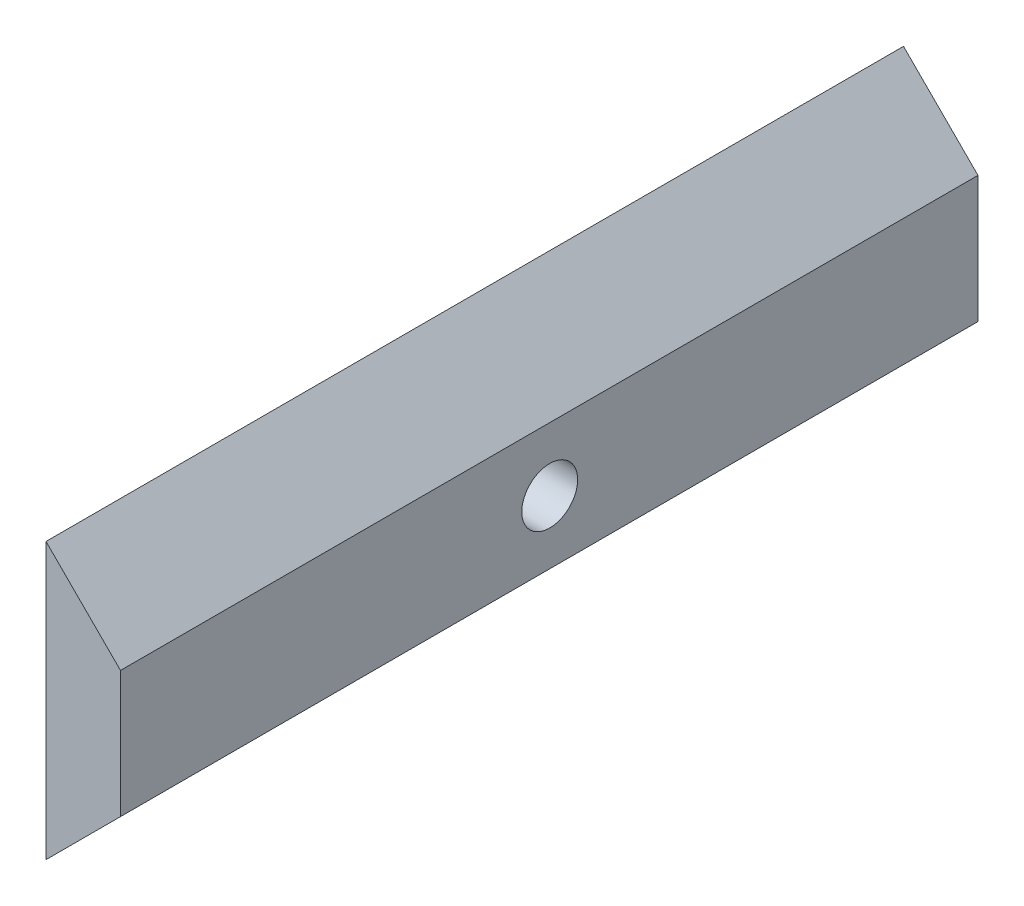
ISO-10303-21;
HEADER;
FILE_DESCRIPTION(('STEP AP214'),'2;1');
FILE_NAME('part.step','',(''),(''),'','','');
FILE_SCHEMA(('AUTOMOTIVE_DESIGN { 1 0 10303 214 1 1 1 1 }'));
ENDSEC;
DATA;
#1=APPLICATION_CONTEXT('core data for automotive mechanical design processes');
#2=APPLICATION_PROTOCOL_DEFINITION('international standard','automotive_design',2000,#1);
#3=PRODUCT_CONTEXT('',#1,'mechanical');
#4=PRODUCT('Part','Part','',(#3));
#5=PRODUCT_RELATED_PRODUCT_CATEGORY('part','',(#4));
#6=PRODUCT_DEFINITION_FORMATION('','',#4);
#7=PRODUCT_DEFINITION_CONTEXT('part definition',#1,'design');
#8=PRODUCT_DEFINITION('design','',#6,#7);
#9=PRODUCT_DEFINITION_SHAPE('','',#8);
#10=(LENGTH_UNIT() NAMED_UNIT(*) SI_UNIT(.MILLI.,.METRE.));
#11=(NAMED_UNIT(*) PLANE_ANGLE_UNIT() SI_UNIT($,.RADIAN.));
#12=(NAMED_UNIT(*) SI_UNIT($,.STERADIAN.) SOLID_ANGLE_UNIT());
#13=UNCERTAINTY_MEASURE_WITH_UNIT(LENGTH_MEASURE(1.E-05),#10,'distance_accuracy_value','');
#14=(GEOMETRIC_REPRESENTATION_CONTEXT(3) GLOBAL_UNCERTAINTY_ASSIGNED_CONTEXT((#13)) GLOBAL_UNIT_ASSIGNED_CONTEXT((#10,
#11,#12)) REPRESENTATION_CONTEXT('',''));
#15=CARTESIAN_POINT('',(0.,0.,0.));
#16=DIRECTION('',(0.,0.,1.));
#17=DIRECTION('',(1.,0.,0.));
#18=AXIS2_PLACEMENT_3D('',#15,#16,#17);
#19=CARTESIAN_POINT('',(9.02192778995276,9.02192778995276,30.6905071586947));
#20=DIRECTION('',(0.707106781186547,0.707106781186548,0.));
#21=DIRECTION('',(-0.707106781186548,0.707106781186547,0.));
#22=AXIS2_PLACEMENT_3D('',#19,#20,#21);
#23=PLANE('',#22);
#24=DIRECTION('',(-0.707106781186548,0.707106781186547,0.));
#25=VECTOR('',#24,1.);
#26=CARTESIAN_POINT('',(9.02192778995276,9.02192778995277,23.025));
#27=LINE('',#26,#25);
#28=CARTESIAN_POINT('',(12.7465605973244,5.29729498258108,23.025));
#29=VERTEX_POINT('',#28);
#30=CARTESIAN_POINT('',(10.7465605973244,7.29729498258108,23.025));
#31=VERTEX_POINT('',#30);
#32=EDGE_CURVE('E43',#29,#31,#27,.T.);
#33=ORIENTED_EDGE('',*,*,#32,.F.);
#34=DIRECTION('',(0.,0.,-1.));
#35=VECTOR('',#34,1.);
#36=CARTESIAN_POINT('',(12.7465605973244,5.29729498258108,30.6905071586947));
#37=LINE('',#36,#35);
#38=CARTESIAN_POINT('',(12.7465605973244,5.29729498258108,0.));
#39=VERTEX_POINT('',#38);
#40=EDGE_CURVE('E93',#29,#39,#37,.T.);
#41=ORIENTED_EDGE('',*,*,#40,.T.);
#42=DIRECTION('',(0.707106781186548,-0.707106781186547,0.));
#43=VECTOR('',#42,1.);
#44=CARTESIAN_POINT('',(9.02192778995276,9.02192778995276,0.));
#45=LINE('',#44,#43);
#46=CARTESIAN_POINT('',(10.7465605973244,7.29729498258108,0.));
#47=VERTEX_POINT('',#46);
#48=EDGE_CURVE('E87',#47,#39,#45,.T.);
#49=ORIENTED_EDGE('',*,*,#48,.F.);
#50=DIRECTION('',(0.,0.,-1.));
#51=VECTOR('',#50,1.);
#52=CARTESIAN_POINT('',(10.7465605973244,7.29729498258108,30.6905071586947));
#53=LINE('',#52,#51);
#54=EDGE_CURVE('E72',#31,#47,#53,.T.);
#55=ORIENTED_EDGE('',*,*,#54,.F.);
#56=EDGE_LOOP('',(#33,#41,#49,#55));
#57=FACE_BOUND('',#56,.T.);
#58=ADVANCED_FACE('F35',(#57),#23,.T.);
#59=CARTESIAN_POINT('',(10.7465605973244,0.,30.6905071586947));
#60=DIRECTION('',(1.,0.,0.));
#61=DIRECTION('',(0.,0.,-1.));
#62=AXIS2_PLACEMENT_3D('',#59,#60,#61);
#63=PLANE('',#62);
#64=CARTESIAN_POINT('',(10.7465605973244,3.59729498258107,11.5));
#65=DIRECTION('',(1.,0.,0.));
#66=DIRECTION('',(0.,0.,-1.));
#67=AXIS2_PLACEMENT_3D('',#64,#65,#66);
#68=CIRCLE('',#67,0.749999999999999);
#69=CARTESIAN_POINT('',(10.7465605973244,3.59729498258107,10.75));
#70=VERTEX_POINT('',#69);
#71=EDGE_CURVE('E96',#70,#70,#68,.F.);
#72=ORIENTED_EDGE('',*,*,#71,.F.);
#73=EDGE_LOOP('',(#72));
#74=FACE_BOUND('',#73,.T.);
#75=DIRECTION('',(0.,0.,-1.));
#76=VECTOR('',#75,1.);
#77=CARTESIAN_POINT('',(10.7465605973244,-0.102705017418907,30.6905071586947));
#78=LINE('',#77,#76);
#79=CARTESIAN_POINT('',(10.7465605973244,-0.102705017418907,23.025));
#80=VERTEX_POINT('',#79);
#81=CARTESIAN_POINT('',(10.7465605973244,-0.102705017418907,0.));
#82=VERTEX_POINT('',#81);
#83=EDGE_CURVE('E81',#80,#82,#78,.T.);
#84=ORIENTED_EDGE('',*,*,#83,.F.);
#85=DIRECTION('',(0.,1.,0.));
#86=VECTOR('',#85,1.);
#87=CARTESIAN_POINT('',(10.7465605973244,0.,23.025));
#88=LINE('',#87,#86);
#89=EDGE_CURVE('E50',#80,#31,#88,.T.);
#90=ORIENTED_EDGE('',*,*,#89,.T.);
#91=ORIENTED_EDGE('',*,*,#54,.T.);
#92=DIRECTION('',(0.,-1.,0.));
#93=VECTOR('',#92,1.);
#94=CARTESIAN_POINT('',(10.7465605973244,0.,0.));
#95=LINE('',#94,#93);
#96=EDGE_CURVE('E76',#47,#82,#95,.T.);
#97=ORIENTED_EDGE('',*,*,#96,.T.);
#98=EDGE_LOOP('',(#84,#90,#91,#97));
#99=FACE_BOUND('',#98,.T.);
#100=ADVANCED_FACE('F75',(#74,#99),#63,.F.);
#101=CARTESIAN_POINT('',(5.42463280737169,-5.42463280737168,30.6905071586947));
#102=DIRECTION('',(-0.707106781186549,0.707106781186546,0.));
#103=DIRECTION('',(-0.707106781186546,-0.707106781186549,0.));
#104=AXIS2_PLACEMENT_3D('',#101,#102,#103);
#105=PLANE('',#104);
#106=DIRECTION('',(0.,0.,-1.));
#107=VECTOR('',#106,1.);
#108=CARTESIAN_POINT('',(12.7465605973244,1.8972949825811,30.6905071586947));
#109=LINE('',#108,#107);
#110=CARTESIAN_POINT('',(12.7465605973244,1.8972949825811,23.025));
#111=VERTEX_POINT('',#110);
#112=CARTESIAN_POINT('',(12.7465605973244,1.8972949825811,0.));
#113=VERTEX_POINT('',#112);
#114=EDGE_CURVE('E104',#111,#113,#109,.T.);
#115=ORIENTED_EDGE('',*,*,#114,.F.);
#116=DIRECTION('',(-0.707106781186546,-0.707106781186549,0.));
#117=VECTOR('',#116,1.);
#118=CARTESIAN_POINT('',(5.4246328073717,-5.42463280737167,23.025));
#119=LINE('',#118,#117);
#120=EDGE_CURVE('E80',#111,#80,#119,.T.);
#121=ORIENTED_EDGE('',*,*,#120,.T.);
#122=ORIENTED_EDGE('',*,*,#83,.T.);
#123=DIRECTION('',(0.707106781186546,0.707106781186549,0.));
#124=VECTOR('',#123,1.);
#125=CARTESIAN_POINT('',(5.42463280737169,-5.42463280737168,0.));
#126=LINE('',#125,#124);
#127=EDGE_CURVE('E90',#82,#113,#126,.T.);
#128=ORIENTED_EDGE('',*,*,#127,.T.);
#129=EDGE_LOOP('',(#115,#121,#122,#128));
#130=FACE_BOUND('',#129,.T.);
#131=ADVANCED_FACE('F108',(#130),#105,.F.);
#132=CARTESIAN_POINT('',(12.7465605973244,0.,30.6905071586947));
#133=DIRECTION('',(1.,0.,0.));
#134=DIRECTION('',(0.,0.,-1.));
#135=AXIS2_PLACEMENT_3D('',#132,#133,#134);
#136=PLANE('',#135);
#137=CARTESIAN_POINT('',(12.7465605973244,3.59729498258107,11.5));
#138=DIRECTION('',(1.,0.,0.));
#139=DIRECTION('',(0.,0.,-1.));
#140=AXIS2_PLACEMENT_3D('',#137,#138,#139);
#141=CIRCLE('',#140,0.749999999999999);
#142=CARTESIAN_POINT('',(12.7465605973244,3.59729498258107,10.75));
#143=VERTEX_POINT('',#142);
#144=EDGE_CURVE('E38',#143,#143,#141,.T.);
#145=ORIENTED_EDGE('',*,*,#144,.F.);
#146=EDGE_LOOP('',(#145));
#147=FACE_BOUND('',#146,.T.);
#148=DIRECTION('',(0.,1.,0.));
#149=VECTOR('',#148,1.);
#150=CARTESIAN_POINT('',(12.7465605973244,0.,23.025));
#151=LINE('',#150,#149);
#152=EDGE_CURVE('E11',#111,#29,#151,.T.);
#153=ORIENTED_EDGE('',*,*,#152,.F.);
#154=ORIENTED_EDGE('',*,*,#114,.T.);
#155=DIRECTION('',(0.,-1.,0.));
#156=VECTOR('',#155,1.);
#157=CARTESIAN_POINT('',(12.7465605973244,0.,0.));
#158=LINE('',#157,#156);
#159=EDGE_CURVE('E101',#39,#113,#158,.T.);
#160=ORIENTED_EDGE('',*,*,#159,.F.);
#161=ORIENTED_EDGE('',*,*,#40,.F.);
#162=EDGE_LOOP('',(#153,#154,#160,#161));
#163=FACE_BOUND('',#162,.T.);
#164=ADVANCED_FACE('F122',(#147,#163),#136,.T.);
#165=CARTESIAN_POINT('',(0.,0.,0.));
#166=DIRECTION('',(0.,0.,1.));
#167=DIRECTION('',(1.,0.,0.));
#168=AXIS2_PLACEMENT_3D('',#165,#166,#167);
#169=PLANE('',#168);
#170=ORIENTED_EDGE('',*,*,#48,.T.);
#171=ORIENTED_EDGE('',*,*,#159,.T.);
#172=ORIENTED_EDGE('',*,*,#127,.F.);
#173=ORIENTED_EDGE('',*,*,#96,.F.);
#174=EDGE_LOOP('',(#170,#171,#172,#173));
#175=FACE_BOUND('',#174,.T.);
#176=ADVANCED_FACE('F85',(#175),#169,.F.);
#177=CARTESIAN_POINT('',(7.74656059732566,7.89729498258167,23.025));
#178=DIRECTION('',(0.,0.,-1.));
#179=DIRECTION('',(-1.,0.,0.));
#180=AXIS2_PLACEMENT_3D('',#177,#178,#179);
#181=PLANE('',#180);
#182=ORIENTED_EDGE('',*,*,#32,.T.);
#183=ORIENTED_EDGE('',*,*,#89,.F.);
#184=ORIENTED_EDGE('',*,*,#120,.F.);
#185=ORIENTED_EDGE('',*,*,#152,.T.);
#186=EDGE_LOOP('',(#182,#183,#184,#185));
#187=FACE_BOUND('',#186,.T.);
#188=ADVANCED_FACE('F130',(#187),#181,.F.);
#189=CARTESIAN_POINT('',(14.2465605973244,3.59729498258107,11.5));
#190=DIRECTION('',(1.,0.,0.));
#191=DIRECTION('',(0.,0.,-1.));
#192=AXIS2_PLACEMENT_3D('',#189,#190,#191);
#193=CYLINDRICAL_SURFACE('',#192,0.749999999999999);
#194=ORIENTED_EDGE('',*,*,#144,.T.);
#195=EDGE_LOOP('',(#194));
#196=FACE_BOUND('',#195,.T.);
#197=ORIENTED_EDGE('',*,*,#71,.T.);
#198=EDGE_LOOP('',(#197));
#199=FACE_BOUND('',#198,.T.);
#200=ADVANCED_FACE('F115',(#196,#199),#193,.F.);
#201=CLOSED_SHELL('',(#58,#100,#131,#164,#176,#188,#200));
#202=MANIFOLD_SOLID_BREP('B2',#201);
#203=ADVANCED_BREP_SHAPE_REPRESENTATION('',(#18,#202),#14);
#204=SHAPE_DEFINITION_REPRESENTATION(#9,#203);
ENDSEC;
END-ISO-10303-21;
